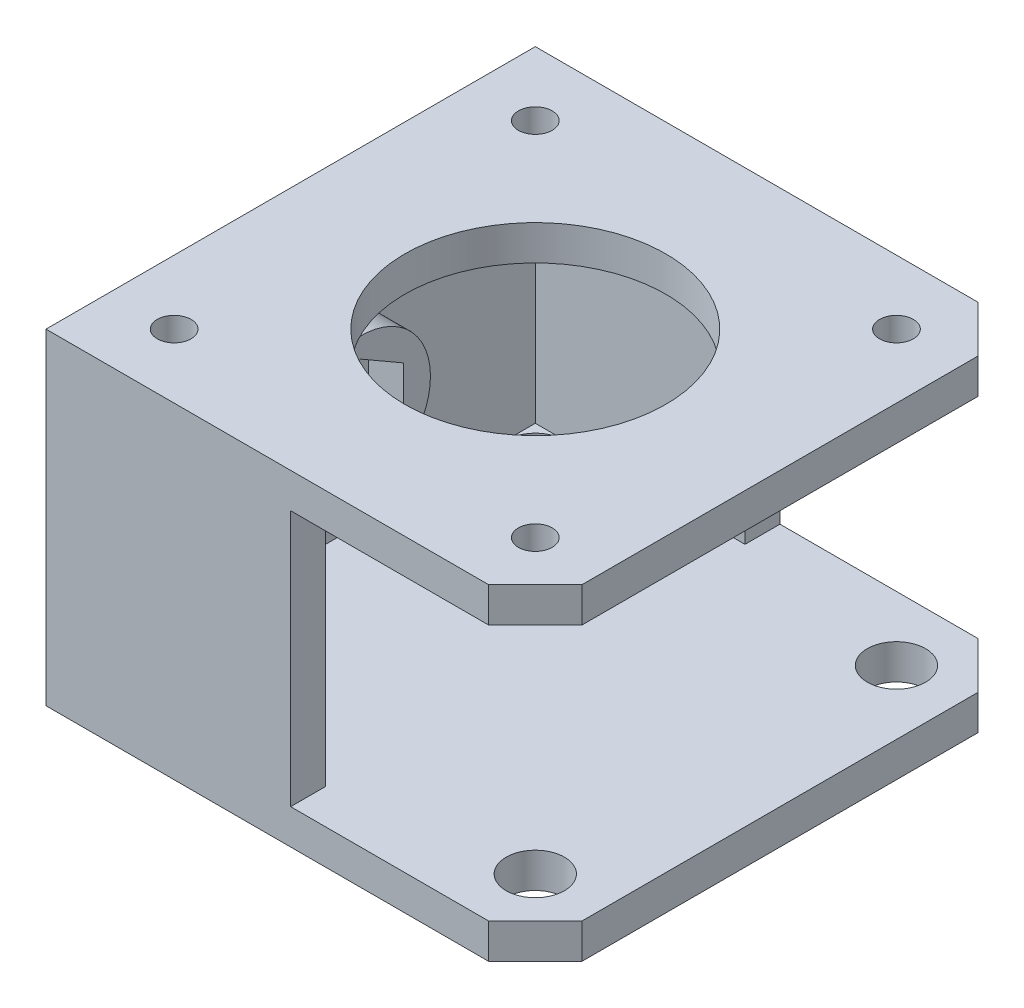
ISO-10303-21;
HEADER;
FILE_DESCRIPTION(('STEP AP214'),'2;1');
FILE_NAME('part.step','',(''),(''),'','','');
FILE_SCHEMA(('AUTOMOTIVE_DESIGN { 1 0 10303 214 1 1 1 1 }'));
ENDSEC;
DATA;
#1=APPLICATION_CONTEXT('core data for automotive mechanical design processes');
#2=APPLICATION_PROTOCOL_DEFINITION('international standard','automotive_design',2000,#1);
#3=PRODUCT_CONTEXT('',#1,'mechanical');
#4=PRODUCT('Part','Part','',(#3));
#5=PRODUCT_RELATED_PRODUCT_CATEGORY('part','',(#4));
#6=PRODUCT_DEFINITION_FORMATION('','',#4);
#7=PRODUCT_DEFINITION_CONTEXT('part definition',#1,'design');
#8=PRODUCT_DEFINITION('design','',#6,#7);
#9=PRODUCT_DEFINITION_SHAPE('','',#8);
#10=(LENGTH_UNIT() NAMED_UNIT(*) SI_UNIT(.MILLI.,.METRE.));
#11=(NAMED_UNIT(*) PLANE_ANGLE_UNIT() SI_UNIT($,.RADIAN.));
#12=(NAMED_UNIT(*) SI_UNIT($,.STERADIAN.) SOLID_ANGLE_UNIT());
#13=UNCERTAINTY_MEASURE_WITH_UNIT(LENGTH_MEASURE(1.E-05),#10,'distance_accuracy_value','');
#14=(GEOMETRIC_REPRESENTATION_CONTEXT(3) GLOBAL_UNCERTAINTY_ASSIGNED_CONTEXT((#13)) GLOBAL_UNIT_ASSIGNED_CONTEXT((#10,
#11,#12)) REPRESENTATION_CONTEXT('',''));
#15=CARTESIAN_POINT('',(0.,0.,0.));
#16=DIRECTION('',(0.,0.,1.));
#17=DIRECTION('',(1.,0.,0.));
#18=AXIS2_PLACEMENT_3D('',#15,#16,#17);
#19=CARTESIAN_POINT('',(0.,-22.,0.));
#20=DIRECTION('',(0.,-1.,0.));
#21=DIRECTION('',(0.,0.,-1.));
#22=AXIS2_PLACEMENT_3D('',#19,#20,#21);
#23=PLANE('',#22);
#24=CARTESIAN_POINT('',(15.5,-22.,-15.5));
#25=DIRECTION('',(0.,1.,0.));
#26=DIRECTION('',(0.,0.,1.));
#27=AXIS2_PLACEMENT_3D('',#24,#25,#26);
#28=CIRCLE('',#27,2.5);
#29=CARTESIAN_POINT('',(15.5,-22.,-13.));
#30=VERTEX_POINT('',#29);
#31=EDGE_CURVE('E314',#30,#30,#28,.T.);
#32=ORIENTED_EDGE('',*,*,#31,.F.);
#33=EDGE_LOOP('',(#32));
#34=FACE_BOUND('',#33,.T.);
#35=CARTESIAN_POINT('',(15.5,-22.,15.5));
#36=DIRECTION('',(0.,1.,0.));
#37=DIRECTION('',(0.,0.,1.));
#38=AXIS2_PLACEMENT_3D('',#35,#36,#37);
#39=CIRCLE('',#38,2.50000000000082);
#40=CARTESIAN_POINT('',(15.5,-22.,18.0000000000008));
#41=VERTEX_POINT('',#40);
#42=EDGE_CURVE('E317',#41,#41,#39,.T.);
#43=ORIENTED_EDGE('',*,*,#42,.F.);
#44=EDGE_LOOP('',(#43));
#45=FACE_BOUND('',#44,.T.);
#46=DIRECTION('',(0.,0.,-1.));
#47=VECTOR('',#46,1.);
#48=CARTESIAN_POINT('',(21.,-22.,0.));
#49=LINE('',#48,#47);
#50=CARTESIAN_POINT('',(21.,-22.,17.));
#51=VERTEX_POINT('',#50);
#52=CARTESIAN_POINT('',(21.,-22.,-17.));
#53=VERTEX_POINT('',#52);
#54=EDGE_CURVE('E240',#51,#53,#49,.T.);
#55=ORIENTED_EDGE('',*,*,#54,.T.);
#56=DIRECTION('',(-0.707106781186548,0.,-0.707106781186548));
#57=VECTOR('',#56,1.);
#58=CARTESIAN_POINT('',(17.,-22.,-21.));
#59=LINE('',#58,#57);
#60=CARTESIAN_POINT('',(17.,-22.,-21.));
#61=VERTEX_POINT('',#60);
#62=EDGE_CURVE('E465',#53,#61,#59,.T.);
#63=ORIENTED_EDGE('',*,*,#62,.T.);
#64=DIRECTION('',(1.,0.,0.));
#65=VECTOR('',#64,1.);
#66=CARTESIAN_POINT('',(0.,-22.,-21.));
#67=LINE('',#66,#65);
#68=CARTESIAN_POINT('',(0.,-22.,-21.));
#69=VERTEX_POINT('',#68);
#70=EDGE_CURVE('E243',#69,#61,#67,.T.);
#71=ORIENTED_EDGE('',*,*,#70,.F.);
#72=DIRECTION('',(0.,0.,1.));
#73=VECTOR('',#72,1.);
#74=CARTESIAN_POINT('',(0.,-22.,0.));
#75=LINE('',#74,#73);
#76=CARTESIAN_POINT('',(0.,-22.,-18.));
#77=VERTEX_POINT('',#76);
#78=EDGE_CURVE('E361',#69,#77,#75,.T.);
#79=ORIENTED_EDGE('',*,*,#78,.T.);
#80=DIRECTION('',(1.,0.,0.));
#81=VECTOR('',#80,1.);
#82=CARTESIAN_POINT('',(0.,-22.,-18.));
#83=LINE('',#82,#81);
#84=CARTESIAN_POINT('',(-15.5,-22.,-18.));
#85=VERTEX_POINT('',#84);
#86=EDGE_CURVE('E234',#85,#77,#83,.T.);
#87=ORIENTED_EDGE('',*,*,#86,.F.);
#88=CARTESIAN_POINT('',(-15.5,-22.,-15.5));
#89=DIRECTION('',(0.,-1.,0.));
#90=DIRECTION('',(0.,0.,-1.));
#91=AXIS2_PLACEMENT_3D('',#88,#89,#90);
#92=CIRCLE('',#91,2.49999999999975);
#93=CARTESIAN_POINT('',(-17.9999999999997,-22.,-15.5));
#94=VERTEX_POINT('',#93);
#95=EDGE_CURVE('E220',#85,#94,#92,.T.);
#96=ORIENTED_EDGE('',*,*,#95,.T.);
#97=DIRECTION('',(0.,0.,-1.));
#98=VECTOR('',#97,1.);
#99=CARTESIAN_POINT('',(-18.,-22.,0.));
#100=LINE('',#99,#98);
#101=CARTESIAN_POINT('',(-18.0000000000006,-22.,15.5));
#102=VERTEX_POINT('',#101);
#103=EDGE_CURVE('E224',#102,#94,#100,.T.);
#104=ORIENTED_EDGE('',*,*,#103,.F.);
#105=CARTESIAN_POINT('',(-15.5,-22.,15.5));
#106=DIRECTION('',(0.,1.,0.));
#107=DIRECTION('',(0.,0.,1.));
#108=AXIS2_PLACEMENT_3D('',#105,#106,#107);
#109=CIRCLE('',#108,2.50000000000057);
#110=CARTESIAN_POINT('',(-15.5,-22.,18.));
#111=VERTEX_POINT('',#110);
#112=EDGE_CURVE('E203',#111,#102,#109,.T.);
#113=ORIENTED_EDGE('',*,*,#112,.F.);
#114=DIRECTION('',(1.,0.,0.));
#115=VECTOR('',#114,1.);
#116=CARTESIAN_POINT('',(0.,-22.,18.));
#117=LINE('',#116,#115);
#118=CARTESIAN_POINT('',(0.,-22.,18.));
#119=VERTEX_POINT('',#118);
#120=EDGE_CURVE('E434',#111,#119,#117,.T.);
#121=ORIENTED_EDGE('',*,*,#120,.T.);
#122=DIRECTION('',(0.,0.,1.));
#123=VECTOR('',#122,1.);
#124=CARTESIAN_POINT('',(0.,-22.,0.));
#125=LINE('',#124,#123);
#126=CARTESIAN_POINT('',(0.,-22.,21.));
#127=VERTEX_POINT('',#126);
#128=EDGE_CURVE('E517',#119,#127,#125,.T.);
#129=ORIENTED_EDGE('',*,*,#128,.T.);
#130=DIRECTION('',(1.,0.,0.));
#131=VECTOR('',#130,1.);
#132=CARTESIAN_POINT('',(0.,-22.,21.));
#133=LINE('',#132,#131);
#134=CARTESIAN_POINT('',(17.,-22.,21.));
#135=VERTEX_POINT('',#134);
#136=EDGE_CURVE('E238',#127,#135,#133,.T.);
#137=ORIENTED_EDGE('',*,*,#136,.T.);
#138=DIRECTION('',(-0.707106781186548,0.,0.707106781186548));
#139=VECTOR('',#138,1.);
#140=CARTESIAN_POINT('',(21.,-22.,17.));
#141=LINE('',#140,#139);
#142=EDGE_CURVE('E463',#135,#51,#141,.F.);
#143=ORIENTED_EDGE('',*,*,#142,.T.);
#144=EDGE_LOOP('',(#55,#63,#71,#79,#87,#96,#104,#113,#121,#129,#137,#143));
#145=FACE_BOUND('',#144,.T.);
#146=ADVANCED_FACE('F40',(#34,#45,#145),#23,.F.);
#147=CARTESIAN_POINT('',(-18.,-22.,18.));
#148=VERTEX_POINT('',#147);
#149=EDGE_CURVE('E219',#148,#111,#117,.T.);
#150=ORIENTED_EDGE('',*,*,#149,.T.);
#151=CARTESIAN_POINT('',(-15.5,-22.,15.5));
#152=DIRECTION('',(0.,-1.,0.));
#153=DIRECTION('',(0.,0.,-1.));
#154=AXIS2_PLACEMENT_3D('',#151,#152,#153);
#155=CIRCLE('',#154,2.50000000000057);
#156=EDGE_CURVE('E206',#111,#102,#155,.T.);
#157=ORIENTED_EDGE('',*,*,#156,.T.);
#158=EDGE_CURVE('E217',#148,#102,#100,.T.);
#159=ORIENTED_EDGE('',*,*,#158,.F.);
#160=EDGE_LOOP('',(#150,#157,#159));
#161=FACE_BOUND('',#160,.T.);
#162=ADVANCED_FACE('F215',(#161),#23,.F.);
#163=CARTESIAN_POINT('',(-18.,-25.,0.));
#164=DIRECTION('',(1.,0.,0.));
#165=DIRECTION('',(0.,0.,-1.));
#166=AXIS2_PLACEMENT_3D('',#163,#164,#165);
#167=PLANE('',#166);
#168=CARTESIAN_POINT('',(-18.,-11.,0.));
#169=DIRECTION('',(1.,0.,0.));
#170=DIRECTION('',(0.,0.,-1.));
#171=AXIS2_PLACEMENT_3D('',#168,#169,#170);
#172=CIRCLE('',#171,2.2);
#173=CARTESIAN_POINT('',(-18.,-11.,-2.2));
#174=VERTEX_POINT('',#173);
#175=EDGE_CURVE('E252',#174,#174,#172,.T.);
#176=ORIENTED_EDGE('',*,*,#175,.F.);
#177=EDGE_LOOP('',(#176));
#178=FACE_BOUND('',#177,.T.);
#179=DIRECTION('',(0.,0.5,0.866025403784439));
#180=VECTOR('',#179,1.);
#181=CARTESIAN_POINT('',(-18.,-5.04570600599758,2.91313972081442));
#182=LINE('',#181,#180);
#183=CARTESIAN_POINT('',(-18.,-8.86380400399839,-3.7));
#184=VERTEX_POINT('',#183);
#185=CARTESIAN_POINT('',(-18.,-6.72760800799677,0.));
#186=VERTEX_POINT('',#185);
#187=EDGE_CURVE('E292',#184,#186,#182,.T.);
#188=ORIENTED_EDGE('',*,*,#187,.T.);
#189=DIRECTION('',(0.,-0.5,0.866025403784439));
#190=VECTOR('',#189,1.);
#191=CARTESIAN_POINT('',(-18.,-5.04570600599758,-2.91313972081441));
#192=LINE('',#191,#190);
#193=CARTESIAN_POINT('',(-18.,-8.86380400399839,3.7));
#194=VERTEX_POINT('',#193);
#195=EDGE_CURVE('E282',#186,#194,#192,.T.);
#196=ORIENTED_EDGE('',*,*,#195,.T.);
#197=DIRECTION('',(0.,-1.,0.));
#198=VECTOR('',#197,1.);
#199=CARTESIAN_POINT('',(-18.,0.,3.7));
#200=LINE('',#199,#198);
#201=CARTESIAN_POINT('',(-18.,-13.1361959960016,3.7));
#202=VERTEX_POINT('',#201);
#203=EDGE_CURVE('E284',#194,#202,#200,.T.);
#204=ORIENTED_EDGE('',*,*,#203,.T.);
#205=DIRECTION('',(0.,-0.5,-0.866025403784439));
#206=VECTOR('',#205,1.);
#207=CARTESIAN_POINT('',(-18.,-11.4542939940024,6.61313972081442));
#208=LINE('',#207,#206);
#209=CARTESIAN_POINT('',(-18.,-15.2723919920032,0.));
#210=VERTEX_POINT('',#209);
#211=EDGE_CURVE('E286',#202,#210,#208,.T.);
#212=ORIENTED_EDGE('',*,*,#211,.T.);
#213=DIRECTION('',(0.,0.5,-0.866025403784439));
#214=VECTOR('',#213,1.);
#215=CARTESIAN_POINT('',(-18.,-11.4542939940024,-6.61313972081441));
#216=LINE('',#215,#214);
#217=CARTESIAN_POINT('',(-18.,-13.1361959960016,-3.7));
#218=VERTEX_POINT('',#217);
#219=EDGE_CURVE('E288',#210,#218,#216,.T.);
#220=ORIENTED_EDGE('',*,*,#219,.T.);
#221=DIRECTION('',(0.,1.,0.));
#222=VECTOR('',#221,1.);
#223=CARTESIAN_POINT('',(-18.,0.,-3.7));
#224=LINE('',#223,#222);
#225=EDGE_CURVE('E290',#218,#184,#224,.T.);
#226=ORIENTED_EDGE('',*,*,#225,.T.);
#227=EDGE_LOOP('',(#188,#196,#204,#212,#220,#226));
#228=FACE_BOUND('',#227,.T.);
#229=ADVANCED_FACE('F341',(#178,#228),#167,.T.);
#230=CARTESIAN_POINT('',(0.,-25.,0.));
#231=DIRECTION('',(-1.,0.,0.));
#232=DIRECTION('',(0.,0.,1.));
#233=AXIS2_PLACEMENT_3D('',#230,#231,#232);
#234=PLANE('',#233);
#235=ORIENTED_EDGE('',*,*,#128,.F.);
#236=DIRECTION('',(0.,1.,0.));
#237=VECTOR('',#236,1.);
#238=CARTESIAN_POINT('',(0.,-25.,18.));
#239=LINE('',#238,#237);
#240=CARTESIAN_POINT('',(0.,0.,18.));
#241=VERTEX_POINT('',#240);
#242=EDGE_CURVE('E372',#119,#241,#239,.T.);
#243=ORIENTED_EDGE('',*,*,#242,.T.);
#244=DIRECTION('',(0.,0.,1.));
#245=VECTOR('',#244,1.);
#246=CARTESIAN_POINT('',(0.,0.,0.));
#247=LINE('',#246,#245);
#248=CARTESIAN_POINT('',(0.,0.,21.));
#249=VERTEX_POINT('',#248);
#250=EDGE_CURVE('E519',#241,#249,#247,.T.);
#251=ORIENTED_EDGE('',*,*,#250,.T.);
#252=DIRECTION('',(0.,1.,0.));
#253=VECTOR('',#252,1.);
#254=CARTESIAN_POINT('',(0.,-25.,21.));
#255=LINE('',#254,#253);
#256=EDGE_CURVE('E411',#127,#249,#255,.T.);
#257=ORIENTED_EDGE('',*,*,#256,.F.);
#258=EDGE_LOOP('',(#235,#243,#251,#257));
#259=FACE_BOUND('',#258,.T.);
#260=ADVANCED_FACE('F539',(#259),#234,.F.);
#261=CARTESIAN_POINT('',(0.,-25.,0.));
#262=DIRECTION('',(-1.,0.,0.));
#263=DIRECTION('',(0.,0.,1.));
#264=AXIS2_PLACEMENT_3D('',#261,#262,#263);
#265=PLANE('',#264);
#266=ORIENTED_EDGE('',*,*,#78,.F.);
#267=DIRECTION('',(0.,1.,0.));
#268=VECTOR('',#267,1.);
#269=CARTESIAN_POINT('',(0.,-25.,-21.));
#270=LINE('',#269,#268);
#271=CARTESIAN_POINT('',(0.,0.,-21.));
#272=VERTEX_POINT('',#271);
#273=EDGE_CURVE('E370',#69,#272,#270,.T.);
#274=ORIENTED_EDGE('',*,*,#273,.T.);
#275=DIRECTION('',(0.,0.,1.));
#276=VECTOR('',#275,1.);
#277=CARTESIAN_POINT('',(0.,0.,0.));
#278=LINE('',#277,#276);
#279=CARTESIAN_POINT('',(0.,0.,-18.));
#280=VERTEX_POINT('',#279);
#281=EDGE_CURVE('E523',#272,#280,#278,.T.);
#282=ORIENTED_EDGE('',*,*,#281,.T.);
#283=DIRECTION('',(0.,1.,0.));
#284=VECTOR('',#283,1.);
#285=CARTESIAN_POINT('',(0.,-25.,-18.));
#286=LINE('',#285,#284);
#287=EDGE_CURVE('E368',#77,#280,#286,.T.);
#288=ORIENTED_EDGE('',*,*,#287,.F.);
#289=EDGE_LOOP('',(#266,#274,#282,#288));
#290=FACE_BOUND('',#289,.T.);
#291=ADVANCED_FACE('F515',(#290),#265,.F.);
#292=CARTESIAN_POINT('',(0.,-25.,-18.));
#293=DIRECTION('',(0.,0.,1.));
#294=DIRECTION('',(1.,0.,0.));
#295=AXIS2_PLACEMENT_3D('',#292,#293,#294);
#296=PLANE('',#295);
#297=DIRECTION('',(0.,1.,0.));
#298=VECTOR('',#297,1.);
#299=CARTESIAN_POINT('',(-18.,-25.,-18.));
#300=LINE('',#299,#298);
#301=CARTESIAN_POINT('',(-18.,-22.,-18.));
#302=VERTEX_POINT('',#301);
#303=CARTESIAN_POINT('',(-18.,0.,-18.));
#304=VERTEX_POINT('',#303);
#305=EDGE_CURVE('E363',#302,#304,#300,.T.);
#306=ORIENTED_EDGE('',*,*,#305,.F.);
#307=EDGE_CURVE('E235',#302,#85,#83,.T.);
#308=ORIENTED_EDGE('',*,*,#307,.T.);
#309=ORIENTED_EDGE('',*,*,#86,.T.);
#310=ORIENTED_EDGE('',*,*,#287,.T.);
#311=DIRECTION('',(1.,0.,0.));
#312=VECTOR('',#311,1.);
#313=CARTESIAN_POINT('',(0.,0.,-18.));
#314=LINE('',#313,#312);
#315=EDGE_CURVE('E366',#304,#280,#314,.T.);
#316=ORIENTED_EDGE('',*,*,#315,.F.);
#317=EDGE_LOOP('',(#306,#308,#309,#310,#316));
#318=FACE_BOUND('',#317,.T.);
#319=ADVANCED_FACE('F364',(#318),#296,.T.);
#320=CARTESIAN_POINT('',(-18.,-11.,0.));
#321=DIRECTION('',(1.,0.,0.));
#322=DIRECTION('',(0.,0.,-1.));
#323=AXIS2_PLACEMENT_3D('',#320,#321,#322);
#324=CIRCLE('',#323,6.);
#325=CARTESIAN_POINT('',(-18.,-11.,-6.));
#326=VERTEX_POINT('',#325);
#327=EDGE_CURVE('E278',#326,#326,#324,.T.);
#328=ORIENTED_EDGE('',*,*,#327,.F.);
#329=EDGE_LOOP('',(#328));
#330=FACE_BOUND('',#329,.T.);
#331=DIRECTION('',(0.,1.,0.));
#332=VECTOR('',#331,1.);
#333=CARTESIAN_POINT('',(-18.,-25.,18.));
#334=LINE('',#333,#332);
#335=CARTESIAN_POINT('',(-18.,0.,18.));
#336=VERTEX_POINT('',#335);
#337=EDGE_CURVE('E233',#148,#336,#334,.T.);
#338=ORIENTED_EDGE('',*,*,#337,.F.);
#339=ORIENTED_EDGE('',*,*,#158,.T.);
#340=ORIENTED_EDGE('',*,*,#103,.T.);
#341=EDGE_CURVE('E228',#94,#302,#100,.T.);
#342=ORIENTED_EDGE('',*,*,#341,.T.);
#343=ORIENTED_EDGE('',*,*,#305,.T.);
#344=DIRECTION('',(0.,0.,-1.));
#345=VECTOR('',#344,1.);
#346=CARTESIAN_POINT('',(-18.,0.,0.));
#347=LINE('',#346,#345);
#348=EDGE_CURVE('E530',#336,#304,#347,.T.);
#349=ORIENTED_EDGE('',*,*,#348,.F.);
#350=EDGE_LOOP('',(#338,#339,#340,#342,#343,#349));
#351=FACE_BOUND('',#350,.T.);
#352=ADVANCED_FACE('F231',(#330,#351),#167,.T.);
#353=CARTESIAN_POINT('',(0.,-25.,18.));
#354=DIRECTION('',(0.,0.,1.));
#355=DIRECTION('',(1.,0.,0.));
#356=AXIS2_PLACEMENT_3D('',#353,#354,#355);
#357=PLANE('',#356);
#358=ORIENTED_EDGE('',*,*,#149,.F.);
#359=ORIENTED_EDGE('',*,*,#337,.T.);
#360=DIRECTION('',(1.,0.,0.));
#361=VECTOR('',#360,1.);
#362=CARTESIAN_POINT('',(0.,0.,18.));
#363=LINE('',#362,#361);
#364=EDGE_CURVE('E527',#336,#241,#363,.T.);
#365=ORIENTED_EDGE('',*,*,#364,.T.);
#366=ORIENTED_EDGE('',*,*,#242,.F.);
#367=ORIENTED_EDGE('',*,*,#120,.F.);
#368=EDGE_LOOP('',(#358,#359,#365,#366,#367));
#369=FACE_BOUND('',#368,.T.);
#370=ADVANCED_FACE('F542',(#369),#357,.F.);
#371=CARTESIAN_POINT('',(0.,0.,0.));
#372=DIRECTION('',(0.,1.,0.));
#373=DIRECTION('',(0.,0.,1.));
#374=AXIS2_PLACEMENT_3D('',#371,#372,#373);
#375=PLANE('',#374);
#376=CARTESIAN_POINT('',(0.,0.,0.));
#377=DIRECTION('',(0.,1.,0.));
#378=DIRECTION('',(0.,0.,1.));
#379=AXIS2_PLACEMENT_3D('',#376,#377,#378);
#380=CIRCLE('',#379,11.2);
#381=CARTESIAN_POINT('',(0.,0.,11.2));
#382=VERTEX_POINT('',#381);
#383=EDGE_CURVE('E382',#382,#382,#380,.T.);
#384=ORIENTED_EDGE('',*,*,#383,.T.);
#385=EDGE_LOOP('',(#384));
#386=FACE_BOUND('',#385,.T.);
#387=CARTESIAN_POINT('',(-15.5,0.,-15.5));
#388=DIRECTION('',(0.,1.,0.));
#389=DIRECTION('',(0.,0.,1.));
#390=AXIS2_PLACEMENT_3D('',#387,#388,#389);
#391=CIRCLE('',#390,1.45);
#392=CARTESIAN_POINT('',(-15.5,0.,-14.05));
#393=VERTEX_POINT('',#392);
#394=EDGE_CURVE('E426',#393,#393,#391,.T.);
#395=ORIENTED_EDGE('',*,*,#394,.T.);
#396=EDGE_LOOP('',(#395));
#397=FACE_BOUND('',#396,.T.);
#398=CARTESIAN_POINT('',(15.5,0.,-15.5));
#399=DIRECTION('',(0.,1.,0.));
#400=DIRECTION('',(0.,0.,1.));
#401=AXIS2_PLACEMENT_3D('',#398,#399,#400);
#402=CIRCLE('',#401,1.45);
#403=CARTESIAN_POINT('',(15.5,0.,-14.05));
#404=VERTEX_POINT('',#403);
#405=EDGE_CURVE('E423',#404,#404,#402,.T.);
#406=ORIENTED_EDGE('',*,*,#405,.T.);
#407=EDGE_LOOP('',(#406));
#408=FACE_BOUND('',#407,.T.);
#409=CARTESIAN_POINT('',(15.5,0.,15.5));
#410=DIRECTION('',(0.,1.,0.));
#411=DIRECTION('',(0.,0.,1.));
#412=AXIS2_PLACEMENT_3D('',#409,#410,#411);
#413=CIRCLE('',#412,1.45);
#414=CARTESIAN_POINT('',(15.5,0.,16.95));
#415=VERTEX_POINT('',#414);
#416=EDGE_CURVE('E420',#415,#415,#413,.T.);
#417=ORIENTED_EDGE('',*,*,#416,.T.);
#418=EDGE_LOOP('',(#417));
#419=FACE_BOUND('',#418,.T.);
#420=CARTESIAN_POINT('',(-15.5,0.,15.5));
#421=DIRECTION('',(0.,1.,0.));
#422=DIRECTION('',(0.,0.,1.));
#423=AXIS2_PLACEMENT_3D('',#420,#421,#422);
#424=CIRCLE('',#423,1.45);
#425=CARTESIAN_POINT('',(-15.5,0.,16.95));
#426=VERTEX_POINT('',#425);
#427=EDGE_CURVE('E417',#426,#426,#424,.T.);
#428=ORIENTED_EDGE('',*,*,#427,.T.);
#429=EDGE_LOOP('',(#428));
#430=FACE_BOUND('',#429,.T.);
#431=DIRECTION('',(1.,0.,0.));
#432=VECTOR('',#431,1.);
#433=CARTESIAN_POINT('',(0.,0.,-21.));
#434=LINE('',#433,#432);
#435=CARTESIAN_POINT('',(17.,0.,-21.));
#436=VERTEX_POINT('',#435);
#437=EDGE_CURVE('E414',#272,#436,#434,.T.);
#438=ORIENTED_EDGE('',*,*,#437,.T.);
#439=DIRECTION('',(0.707106781186548,0.,0.707106781186548));
#440=VECTOR('',#439,1.);
#441=CARTESIAN_POINT('',(17.,0.,-21.));
#442=LINE('',#441,#440);
#443=CARTESIAN_POINT('',(21.,0.,-17.));
#444=VERTEX_POINT('',#443);
#445=EDGE_CURVE('E445',#436,#444,#442,.T.);
#446=ORIENTED_EDGE('',*,*,#445,.T.);
#447=DIRECTION('',(0.,0.,-1.));
#448=VECTOR('',#447,1.);
#449=CARTESIAN_POINT('',(21.,0.,0.));
#450=LINE('',#449,#448);
#451=CARTESIAN_POINT('',(21.,0.,17.));
#452=VERTEX_POINT('',#451);
#453=EDGE_CURVE('E410',#452,#444,#450,.T.);
#454=ORIENTED_EDGE('',*,*,#453,.F.);
#455=DIRECTION('',(0.707106781186548,0.,-0.707106781186548));
#456=VECTOR('',#455,1.);
#457=CARTESIAN_POINT('',(21.,0.,17.));
#458=LINE('',#457,#456);
#459=CARTESIAN_POINT('',(17.,0.,21.));
#460=VERTEX_POINT('',#459);
#461=EDGE_CURVE('E443',#452,#460,#458,.F.);
#462=ORIENTED_EDGE('',*,*,#461,.T.);
#463=DIRECTION('',(1.,0.,0.));
#464=VECTOR('',#463,1.);
#465=CARTESIAN_POINT('',(0.,0.,21.));
#466=LINE('',#465,#464);
#467=EDGE_CURVE('E407',#249,#460,#466,.T.);
#468=ORIENTED_EDGE('',*,*,#467,.F.);
#469=ORIENTED_EDGE('',*,*,#250,.F.);
#470=ORIENTED_EDGE('',*,*,#364,.F.);
#471=ORIENTED_EDGE('',*,*,#348,.T.);
#472=ORIENTED_EDGE('',*,*,#315,.T.);
#473=ORIENTED_EDGE('',*,*,#281,.F.);
#474=EDGE_LOOP('',(#438,#446,#454,#462,#468,#469,#470,#471,#472,#473));
#475=FACE_BOUND('',#474,.T.);
#476=ADVANCED_FACE('F483',(#386,#397,#408,#419,#430,#475),#375,.F.);
#477=CARTESIAN_POINT('',(-21.,3.,0.));
#478=DIRECTION('',(-1.,0.,0.));
#479=DIRECTION('',(0.,0.,1.));
#480=AXIS2_PLACEMENT_3D('',#477,#478,#479);
#481=PLANE('',#480);
#482=CARTESIAN_POINT('',(-21.,-11.,0.));
#483=DIRECTION('',(1.,0.,0.));
#484=DIRECTION('',(0.,0.,-1.));
#485=AXIS2_PLACEMENT_3D('',#482,#483,#484);
#486=CIRCLE('',#485,2.2);
#487=CARTESIAN_POINT('',(-21.,-11.,-2.2));
#488=VERTEX_POINT('',#487);
#489=EDGE_CURVE('E247',#488,#488,#486,.T.);
#490=ORIENTED_EDGE('',*,*,#489,.T.);
#491=EDGE_LOOP('',(#490));
#492=FACE_BOUND('',#491,.T.);
#493=DIRECTION('',(0.,0.,-1.));
#494=VECTOR('',#493,1.);
#495=CARTESIAN_POINT('',(-21.,-25.,0.));
#496=LINE('',#495,#494);
#497=CARTESIAN_POINT('',(-21.,-25.,21.));
#498=VERTEX_POINT('',#497);
#499=CARTESIAN_POINT('',(-21.,-25.,-21.));
#500=VERTEX_POINT('',#499);
#501=EDGE_CURVE('E500',#498,#500,#496,.T.);
#502=ORIENTED_EDGE('',*,*,#501,.F.);
#503=DIRECTION('',(0.,-1.,0.));
#504=VECTOR('',#503,1.);
#505=CARTESIAN_POINT('',(-21.,3.,21.));
#506=LINE('',#505,#504);
#507=CARTESIAN_POINT('',(-21.,3.,21.));
#508=VERTEX_POINT('',#507);
#509=EDGE_CURVE('E432',#508,#498,#506,.T.);
#510=ORIENTED_EDGE('',*,*,#509,.F.);
#511=DIRECTION('',(0.,0.,-1.));
#512=VECTOR('',#511,1.);
#513=CARTESIAN_POINT('',(-21.,3.,0.));
#514=LINE('',#513,#512);
#515=CARTESIAN_POINT('',(-21.,3.,-21.));
#516=VERTEX_POINT('',#515);
#517=EDGE_CURVE('E378',#508,#516,#514,.T.);
#518=ORIENTED_EDGE('',*,*,#517,.T.);
#519=DIRECTION('',(0.,-1.,0.));
#520=VECTOR('',#519,1.);
#521=CARTESIAN_POINT('',(-21.,3.,-21.));
#522=LINE('',#521,#520);
#523=EDGE_CURVE('E406',#516,#500,#522,.T.);
#524=ORIENTED_EDGE('',*,*,#523,.T.);
#525=EDGE_LOOP('',(#502,#510,#518,#524));
#526=FACE_BOUND('',#525,.T.);
#527=ADVANCED_FACE('F499',(#492,#526),#481,.T.);
#528=CARTESIAN_POINT('',(0.,3.,21.));
#529=DIRECTION('',(0.,0.,-1.));
#530=DIRECTION('',(-1.,0.,0.));
#531=AXIS2_PLACEMENT_3D('',#528,#529,#530);
#532=PLANE('',#531);
#533=DIRECTION('',(1.,0.,0.));
#534=VECTOR('',#533,1.);
#535=CARTESIAN_POINT('',(0.,-25.,21.));
#536=LINE('',#535,#534);
#537=CARTESIAN_POINT('',(17.,-25.,21.));
#538=VERTEX_POINT('',#537);
#539=EDGE_CURVE('E377',#498,#538,#536,.T.);
#540=ORIENTED_EDGE('',*,*,#539,.T.);
#541=DIRECTION('',(0.,1.,0.));
#542=VECTOR('',#541,1.);
#543=CARTESIAN_POINT('',(17.,3.,21.));
#544=LINE('',#543,#542);
#545=EDGE_CURVE('E11',#538,#135,#544,.T.);
#546=ORIENTED_EDGE('',*,*,#545,.T.);
#547=ORIENTED_EDGE('',*,*,#136,.F.);
#548=ORIENTED_EDGE('',*,*,#256,.T.);
#549=ORIENTED_EDGE('',*,*,#467,.T.);
#550=DIRECTION('',(0.,1.,0.));
#551=VECTOR('',#550,1.);
#552=CARTESIAN_POINT('',(17.,3.,21.));
#553=LINE('',#552,#551);
#554=CARTESIAN_POINT('',(17.,3.,21.));
#555=VERTEX_POINT('',#554);
#556=EDGE_CURVE('E49',#460,#555,#553,.T.);
#557=ORIENTED_EDGE('',*,*,#556,.T.);
#558=DIRECTION('',(1.,0.,0.));
#559=VECTOR('',#558,1.);
#560=CARTESIAN_POINT('',(0.,3.,21.));
#561=LINE('',#560,#559);
#562=EDGE_CURVE('E381',#508,#555,#561,.T.);
#563=ORIENTED_EDGE('',*,*,#562,.F.);
#564=ORIENTED_EDGE('',*,*,#509,.T.);
#565=EDGE_LOOP('',(#540,#546,#547,#548,#549,#557,#563,#564));
#566=FACE_BOUND('',#565,.T.);
#567=ADVANCED_FACE('F468',(#566),#532,.F.);
#568=CARTESIAN_POINT('',(21.,3.,0.));
#569=DIRECTION('',(-1.,0.,0.));
#570=DIRECTION('',(0.,0.,1.));
#571=AXIS2_PLACEMENT_3D('',#568,#569,#570);
#572=PLANE('',#571);
#573=ORIENTED_EDGE('',*,*,#453,.T.);
#574=DIRECTION('',(0.,1.,0.));
#575=VECTOR('',#574,1.);
#576=CARTESIAN_POINT('',(21.,3.,-17.));
#577=LINE('',#576,#575);
#578=CARTESIAN_POINT('',(21.,3.,-17.));
#579=VERTEX_POINT('',#578);
#580=EDGE_CURVE('E450',#444,#579,#577,.T.);
#581=ORIENTED_EDGE('',*,*,#580,.T.);
#582=DIRECTION('',(0.,0.,-1.));
#583=VECTOR('',#582,1.);
#584=CARTESIAN_POINT('',(21.,3.,0.));
#585=LINE('',#584,#583);
#586=CARTESIAN_POINT('',(21.,3.,17.));
#587=VERTEX_POINT('',#586);
#588=EDGE_CURVE('E385',#587,#579,#585,.T.);
#589=ORIENTED_EDGE('',*,*,#588,.F.);
#590=DIRECTION('',(0.,-1.,0.));
#591=VECTOR('',#590,1.);
#592=CARTESIAN_POINT('',(21.,3.,17.));
#593=LINE('',#592,#591);
#594=EDGE_CURVE('E447',#587,#452,#593,.T.);
#595=ORIENTED_EDGE('',*,*,#594,.T.);
#596=EDGE_LOOP('',(#573,#581,#589,#595));
#597=FACE_BOUND('',#596,.T.);
#598=ADVANCED_FACE('F480',(#597),#572,.F.);
#599=CARTESIAN_POINT('',(-15.5,3.,-15.5));
#600=DIRECTION('',(0.,-1.,0.));
#601=DIRECTION('',(0.,0.,-1.));
#602=AXIS2_PLACEMENT_3D('',#599,#600,#601);
#603=CYLINDRICAL_SURFACE('',#602,1.45);
#604=CARTESIAN_POINT('',(-15.5,3.,-15.5));
#605=DIRECTION('',(0.,1.,0.));
#606=DIRECTION('',(0.,0.,1.));
#607=AXIS2_PLACEMENT_3D('',#604,#605,#606);
#608=CIRCLE('',#607,1.45);
#609=CARTESIAN_POINT('',(-15.5,3.,-14.05));
#610=VERTEX_POINT('',#609);
#611=EDGE_CURVE('E400',#610,#610,#608,.T.);
#612=ORIENTED_EDGE('',*,*,#611,.T.);
#613=EDGE_LOOP('',(#612));
#614=FACE_BOUND('',#613,.T.);
#615=ORIENTED_EDGE('',*,*,#394,.F.);
#616=EDGE_LOOP('',(#615));
#617=FACE_BOUND('',#616,.T.);
#618=ADVANCED_FACE('F563',(#614,#617),#603,.F.);
#619=CARTESIAN_POINT('',(15.5,3.,-15.5));
#620=DIRECTION('',(0.,-1.,0.));
#621=DIRECTION('',(0.,0.,-1.));
#622=AXIS2_PLACEMENT_3D('',#619,#620,#621);
#623=CYLINDRICAL_SURFACE('',#622,1.45);
#624=CARTESIAN_POINT('',(15.5,3.,-15.5));
#625=DIRECTION('',(0.,1.,0.));
#626=DIRECTION('',(0.,0.,1.));
#627=AXIS2_PLACEMENT_3D('',#624,#625,#626);
#628=CIRCLE('',#627,1.45);
#629=CARTESIAN_POINT('',(15.5,3.,-14.05));
#630=VERTEX_POINT('',#629);
#631=EDGE_CURVE('E397',#630,#630,#628,.T.);
#632=ORIENTED_EDGE('',*,*,#631,.T.);
#633=EDGE_LOOP('',(#632));
#634=FACE_BOUND('',#633,.T.);
#635=ORIENTED_EDGE('',*,*,#405,.F.);
#636=EDGE_LOOP('',(#635));
#637=FACE_BOUND('',#636,.T.);
#638=ADVANCED_FACE('F566',(#634,#637),#623,.F.);
#639=CARTESIAN_POINT('',(15.5,3.,15.5));
#640=DIRECTION('',(0.,-1.,0.));
#641=DIRECTION('',(0.,0.,-1.));
#642=AXIS2_PLACEMENT_3D('',#639,#640,#641);
#643=CYLINDRICAL_SURFACE('',#642,1.45);
#644=CARTESIAN_POINT('',(15.5,3.,15.5));
#645=DIRECTION('',(0.,1.,0.));
#646=DIRECTION('',(0.,0.,1.));
#647=AXIS2_PLACEMENT_3D('',#644,#645,#646);
#648=CIRCLE('',#647,1.45);
#649=CARTESIAN_POINT('',(15.5,3.,16.95));
#650=VERTEX_POINT('',#649);
#651=EDGE_CURVE('E394',#650,#650,#648,.T.);
#652=ORIENTED_EDGE('',*,*,#651,.T.);
#653=EDGE_LOOP('',(#652));
#654=FACE_BOUND('',#653,.T.);
#655=ORIENTED_EDGE('',*,*,#416,.F.);
#656=EDGE_LOOP('',(#655));
#657=FACE_BOUND('',#656,.T.);
#658=ADVANCED_FACE('F570',(#654,#657),#643,.F.);
#659=CARTESIAN_POINT('',(-15.5,3.,15.5));
#660=DIRECTION('',(0.,-1.,0.));
#661=DIRECTION('',(0.,0.,-1.));
#662=AXIS2_PLACEMENT_3D('',#659,#660,#661);
#663=CYLINDRICAL_SURFACE('',#662,1.45);
#664=CARTESIAN_POINT('',(-15.5,3.,15.5));
#665=DIRECTION('',(0.,1.,0.));
#666=DIRECTION('',(0.,0.,1.));
#667=AXIS2_PLACEMENT_3D('',#664,#665,#666);
#668=CIRCLE('',#667,1.45);
#669=CARTESIAN_POINT('',(-15.5,3.,16.95));
#670=VERTEX_POINT('',#669);
#671=EDGE_CURVE('E391',#670,#670,#668,.T.);
#672=ORIENTED_EDGE('',*,*,#671,.T.);
#673=EDGE_LOOP('',(#672));
#674=FACE_BOUND('',#673,.T.);
#675=ORIENTED_EDGE('',*,*,#427,.F.);
#676=EDGE_LOOP('',(#675));
#677=FACE_BOUND('',#676,.T.);
#678=ADVANCED_FACE('F574',(#674,#677),#663,.F.);
#679=CARTESIAN_POINT('',(0.,3.,-21.));
#680=DIRECTION('',(0.,0.,-1.));
#681=DIRECTION('',(-1.,0.,0.));
#682=AXIS2_PLACEMENT_3D('',#679,#680,#681);
#683=PLANE('',#682);
#684=DIRECTION('',(1.,0.,0.));
#685=VECTOR('',#684,1.);
#686=CARTESIAN_POINT('',(0.,3.,-21.));
#687=LINE('',#686,#685);
#688=CARTESIAN_POINT('',(17.,3.,-21.));
#689=VERTEX_POINT('',#688);
#690=EDGE_CURVE('E388',#516,#689,#687,.T.);
#691=ORIENTED_EDGE('',*,*,#690,.T.);
#692=DIRECTION('',(0.,-1.,0.));
#693=VECTOR('',#692,1.);
#694=CARTESIAN_POINT('',(17.,0.,-21.));
#695=LINE('',#694,#693);
#696=EDGE_CURVE('E440',#689,#436,#695,.T.);
#697=ORIENTED_EDGE('',*,*,#696,.T.);
#698=ORIENTED_EDGE('',*,*,#437,.F.);
#699=ORIENTED_EDGE('',*,*,#273,.F.);
#700=ORIENTED_EDGE('',*,*,#70,.T.);
#701=DIRECTION('',(0.,-1.,0.));
#702=VECTOR('',#701,1.);
#703=CARTESIAN_POINT('',(17.,-25.,-21.));
#704=LINE('',#703,#702);
#705=CARTESIAN_POINT('',(17.,-25.,-21.));
#706=VERTEX_POINT('',#705);
#707=EDGE_CURVE('E437',#61,#706,#704,.T.);
#708=ORIENTED_EDGE('',*,*,#707,.T.);
#709=DIRECTION('',(1.,0.,0.));
#710=VECTOR('',#709,1.);
#711=CARTESIAN_POINT('',(0.,-25.,-21.));
#712=LINE('',#711,#710);
#713=EDGE_CURVE('E495',#500,#706,#712,.T.);
#714=ORIENTED_EDGE('',*,*,#713,.F.);
#715=ORIENTED_EDGE('',*,*,#523,.F.);
#716=EDGE_LOOP('',(#691,#697,#698,#699,#700,#708,#714,#715));
#717=FACE_BOUND('',#716,.T.);
#718=ADVANCED_FACE('F491',(#717),#683,.T.);
#719=CARTESIAN_POINT('',(0.,3.,0.));
#720=DIRECTION('',(0.,-1.,0.));
#721=DIRECTION('',(0.,0.,-1.));
#722=AXIS2_PLACEMENT_3D('',#719,#720,#721);
#723=CYLINDRICAL_SURFACE('',#722,11.2);
#724=CARTESIAN_POINT('',(0.,3.,0.));
#725=DIRECTION('',(0.,1.,0.));
#726=DIRECTION('',(0.,0.,1.));
#727=AXIS2_PLACEMENT_3D('',#724,#725,#726);
#728=CIRCLE('',#727,11.2);
#729=CARTESIAN_POINT('',(0.,3.,11.2));
#730=VERTEX_POINT('',#729);
#731=EDGE_CURVE('E403',#730,#730,#728,.T.);
#732=ORIENTED_EDGE('',*,*,#731,.T.);
#733=EDGE_LOOP('',(#732));
#734=FACE_BOUND('',#733,.T.);
#735=ORIENTED_EDGE('',*,*,#383,.F.);
#736=EDGE_LOOP('',(#735));
#737=FACE_BOUND('',#736,.T.);
#738=ADVANCED_FACE('F558',(#734,#737),#723,.F.);
#739=CARTESIAN_POINT('',(0.,3.,0.));
#740=DIRECTION('',(0.,1.,0.));
#741=DIRECTION('',(0.,0.,1.));
#742=AXIS2_PLACEMENT_3D('',#739,#740,#741);
#743=PLANE('',#742);
#744=ORIENTED_EDGE('',*,*,#588,.T.);
#745=DIRECTION('',(-0.707106781186548,0.,-0.707106781186548));
#746=VECTOR('',#745,1.);
#747=CARTESIAN_POINT('',(19.,3.,-19.));
#748=LINE('',#747,#746);
#749=EDGE_CURVE('E454',#579,#689,#748,.T.);
#750=ORIENTED_EDGE('',*,*,#749,.T.);
#751=ORIENTED_EDGE('',*,*,#690,.F.);
#752=ORIENTED_EDGE('',*,*,#517,.F.);
#753=ORIENTED_EDGE('',*,*,#562,.T.);
#754=DIRECTION('',(-0.707106781186548,0.,0.707106781186548));
#755=VECTOR('',#754,1.);
#756=CARTESIAN_POINT('',(19.,3.,19.));
#757=LINE('',#756,#755);
#758=EDGE_CURVE('E452',#555,#587,#757,.F.);
#759=ORIENTED_EDGE('',*,*,#758,.T.);
#760=EDGE_LOOP('',(#744,#750,#751,#752,#753,#759));
#761=FACE_BOUND('',#760,.T.);
#762=ORIENTED_EDGE('',*,*,#671,.F.);
#763=EDGE_LOOP('',(#762));
#764=FACE_BOUND('',#763,.T.);
#765=ORIENTED_EDGE('',*,*,#651,.F.);
#766=EDGE_LOOP('',(#765));
#767=FACE_BOUND('',#766,.T.);
#768=ORIENTED_EDGE('',*,*,#631,.F.);
#769=EDGE_LOOP('',(#768));
#770=FACE_BOUND('',#769,.T.);
#771=ORIENTED_EDGE('',*,*,#611,.F.);
#772=EDGE_LOOP('',(#771));
#773=FACE_BOUND('',#772,.T.);
#774=ORIENTED_EDGE('',*,*,#731,.F.);
#775=EDGE_LOOP('',(#774));
#776=FACE_BOUND('',#775,.T.);
#777=ADVANCED_FACE('F354',(#761,#764,#767,#770,#773,#776),#743,.T.);
#778=CARTESIAN_POINT('',(0.,-25.,0.));
#779=DIRECTION('',(0.,1.,0.));
#780=DIRECTION('',(0.,0.,1.));
#781=AXIS2_PLACEMENT_3D('',#778,#779,#780);
#782=PLANE('',#781);
#783=CARTESIAN_POINT('',(-15.5,-25.,-15.5));
#784=DIRECTION('',(0.,1.,0.));
#785=DIRECTION('',(0.,0.,1.));
#786=AXIS2_PLACEMENT_3D('',#783,#784,#785);
#787=CIRCLE('',#786,2.49999999999975);
#788=CARTESIAN_POINT('',(-15.5,-25.,-13.0000000000002));
#789=VERTEX_POINT('',#788);
#790=EDGE_CURVE('E320',#789,#789,#787,.T.);
#791=ORIENTED_EDGE('',*,*,#790,.T.);
#792=EDGE_LOOP('',(#791));
#793=FACE_BOUND('',#792,.T.);
#794=CARTESIAN_POINT('',(-15.5,-25.,15.5));
#795=DIRECTION('',(0.,1.,0.));
#796=DIRECTION('',(0.,0.,1.));
#797=AXIS2_PLACEMENT_3D('',#794,#795,#796);
#798=CIRCLE('',#797,2.50000000000057);
#799=CARTESIAN_POINT('',(-15.5,-25.,18.0000000000006));
#800=VERTEX_POINT('',#799);
#801=EDGE_CURVE('E211',#800,#800,#798,.T.);
#802=ORIENTED_EDGE('',*,*,#801,.T.);
#803=EDGE_LOOP('',(#802));
#804=FACE_BOUND('',#803,.T.);
#805=CARTESIAN_POINT('',(15.5,-25.,15.5));
#806=DIRECTION('',(0.,1.,0.));
#807=DIRECTION('',(0.,0.,1.));
#808=AXIS2_PLACEMENT_3D('',#805,#806,#807);
#809=CIRCLE('',#808,2.50000000000082);
#810=CARTESIAN_POINT('',(15.5,-25.,18.0000000000008));
#811=VERTEX_POINT('',#810);
#812=EDGE_CURVE('E210',#811,#811,#809,.T.);
#813=ORIENTED_EDGE('',*,*,#812,.T.);
#814=EDGE_LOOP('',(#813));
#815=FACE_BOUND('',#814,.T.);
#816=CARTESIAN_POINT('',(15.5,-25.,-15.5));
#817=DIRECTION('',(0.,1.,0.));
#818=DIRECTION('',(0.,0.,1.));
#819=AXIS2_PLACEMENT_3D('',#816,#817,#818);
#820=CIRCLE('',#819,2.5);
#821=CARTESIAN_POINT('',(15.5,-25.,-13.));
#822=VERTEX_POINT('',#821);
#823=EDGE_CURVE('E294',#822,#822,#820,.T.);
#824=ORIENTED_EDGE('',*,*,#823,.T.);
#825=EDGE_LOOP('',(#824));
#826=FACE_BOUND('',#825,.T.);
#827=ORIENTED_EDGE('',*,*,#713,.T.);
#828=DIRECTION('',(0.707106781186548,0.,0.707106781186548));
#829=VECTOR('',#828,1.);
#830=CARTESIAN_POINT('',(17.,-25.,-21.));
#831=LINE('',#830,#829);
#832=CARTESIAN_POINT('',(21.,-25.,-17.));
#833=VERTEX_POINT('',#832);
#834=EDGE_CURVE('E458',#706,#833,#831,.T.);
#835=ORIENTED_EDGE('',*,*,#834,.T.);
#836=DIRECTION('',(0.,0.,-1.));
#837=VECTOR('',#836,1.);
#838=CARTESIAN_POINT('',(21.,-25.,0.));
#839=LINE('',#838,#837);
#840=CARTESIAN_POINT('',(21.,-25.,17.));
#841=VERTEX_POINT('',#840);
#842=EDGE_CURVE('E246',#841,#833,#839,.T.);
#843=ORIENTED_EDGE('',*,*,#842,.F.);
#844=DIRECTION('',(0.707106781186548,0.,-0.707106781186548));
#845=VECTOR('',#844,1.);
#846=CARTESIAN_POINT('',(21.,-25.,17.));
#847=LINE('',#846,#845);
#848=EDGE_CURVE('E456',#841,#538,#847,.F.);
#849=ORIENTED_EDGE('',*,*,#848,.T.);
#850=ORIENTED_EDGE('',*,*,#539,.F.);
#851=ORIENTED_EDGE('',*,*,#501,.T.);
#852=EDGE_LOOP('',(#827,#835,#843,#849,#850,#851));
#853=FACE_BOUND('',#852,.T.);
#854=ADVANCED_FACE('F347',(#793,#804,#815,#826,#853),#782,.F.);
#855=ORIENTED_EDGE('',*,*,#341,.F.);
#856=CARTESIAN_POINT('',(-15.5,-22.,-15.5));
#857=DIRECTION('',(0.,1.,0.));
#858=DIRECTION('',(0.,0.,1.));
#859=AXIS2_PLACEMENT_3D('',#856,#857,#858);
#860=CIRCLE('',#859,2.49999999999975);
#861=EDGE_CURVE('E323',#85,#94,#860,.T.);
#862=ORIENTED_EDGE('',*,*,#861,.F.);
#863=ORIENTED_EDGE('',*,*,#307,.F.);
#864=EDGE_LOOP('',(#855,#862,#863));
#865=FACE_BOUND('',#864,.T.);
#866=ADVANCED_FACE('F337',(#865),#23,.F.);
#867=CARTESIAN_POINT('',(21.,-22.,0.));
#868=DIRECTION('',(-1.,0.,0.));
#869=DIRECTION('',(0.,0.,1.));
#870=AXIS2_PLACEMENT_3D('',#867,#868,#869);
#871=PLANE('',#870);
#872=ORIENTED_EDGE('',*,*,#842,.T.);
#873=DIRECTION('',(0.,1.,0.));
#874=VECTOR('',#873,1.);
#875=CARTESIAN_POINT('',(21.,-22.,-17.));
#876=LINE('',#875,#874);
#877=EDGE_CURVE('E62',#833,#53,#876,.T.);
#878=ORIENTED_EDGE('',*,*,#877,.T.);
#879=ORIENTED_EDGE('',*,*,#54,.F.);
#880=DIRECTION('',(0.,-1.,0.));
#881=VECTOR('',#880,1.);
#882=CARTESIAN_POINT('',(21.,-22.,17.));
#883=LINE('',#882,#881);
#884=EDGE_CURVE('E460',#51,#841,#883,.T.);
#885=ORIENTED_EDGE('',*,*,#884,.T.);
#886=EDGE_LOOP('',(#872,#878,#879,#885));
#887=FACE_BOUND('',#886,.T.);
#888=ADVANCED_FACE('F346',(#887),#871,.F.);
#889=CARTESIAN_POINT('',(-21.,-11.,0.));
#890=DIRECTION('',(1.,0.,0.));
#891=DIRECTION('',(0.,0.,-1.));
#892=AXIS2_PLACEMENT_3D('',#889,#890,#891);
#893=CYLINDRICAL_SURFACE('',#892,2.2);
#894=ORIENTED_EDGE('',*,*,#489,.F.);
#895=EDGE_LOOP('',(#894));
#896=FACE_BOUND('',#895,.T.);
#897=ORIENTED_EDGE('',*,*,#175,.T.);
#898=EDGE_LOOP('',(#897));
#899=FACE_BOUND('',#898,.T.);
#900=ADVANCED_FACE('F353',(#896,#899),#893,.F.);
#901=CARTESIAN_POINT('',(-15.,-5.04570600599758,2.91313972081442));
#902=DIRECTION('',(0.,-0.866025403784438,0.5));
#903=DIRECTION('',(0.,-0.5,-0.866025403784439));
#904=AXIS2_PLACEMENT_3D('',#901,#902,#903);
#905=PLANE('',#904);
#906=ORIENTED_EDGE('',*,*,#187,.F.);
#907=DIRECTION('',(-1.,0.,0.));
#908=VECTOR('',#907,1.);
#909=CARTESIAN_POINT('',(-15.,-8.86380400399839,-3.7));
#910=LINE('',#909,#908);
#911=CARTESIAN_POINT('',(-15.,-8.86380400399839,-3.7));
#912=VERTEX_POINT('',#911);
#913=EDGE_CURVE('E257',#912,#184,#910,.T.);
#914=ORIENTED_EDGE('',*,*,#913,.F.);
#915=DIRECTION('',(0.,0.5,0.866025403784439));
#916=VECTOR('',#915,1.);
#917=CARTESIAN_POINT('',(-15.,-5.04570600599758,2.91313972081442));
#918=LINE('',#917,#916);
#919=CARTESIAN_POINT('',(-15.,-6.72760800799677,0.));
#920=VERTEX_POINT('',#919);
#921=EDGE_CURVE('E281',#912,#920,#918,.T.);
#922=ORIENTED_EDGE('',*,*,#921,.T.);
#923=DIRECTION('',(-1.,0.,0.));
#924=VECTOR('',#923,1.);
#925=CARTESIAN_POINT('',(-15.,-6.72760800799677,0.));
#926=LINE('',#925,#924);
#927=EDGE_CURVE('E274',#920,#186,#926,.T.);
#928=ORIENTED_EDGE('',*,*,#927,.T.);
#929=EDGE_LOOP('',(#906,#914,#922,#928));
#930=FACE_BOUND('',#929,.T.);
#931=ADVANCED_FACE('F835',(#930),#905,.T.);
#932=CARTESIAN_POINT('',(-15.,0.,-3.7));
#933=DIRECTION('',(0.,0.,1.));
#934=DIRECTION('',(0.,-1.,0.));
#935=AXIS2_PLACEMENT_3D('',#932,#933,#934);
#936=PLANE('',#935);
#937=ORIENTED_EDGE('',*,*,#225,.F.);
#938=DIRECTION('',(-1.,0.,0.));
#939=VECTOR('',#938,1.);
#940=CARTESIAN_POINT('',(-15.,-13.1361959960016,-3.7));
#941=LINE('',#940,#939);
#942=CARTESIAN_POINT('',(-15.,-13.1361959960016,-3.7));
#943=VERTEX_POINT('',#942);
#944=EDGE_CURVE('E262',#943,#218,#941,.T.);
#945=ORIENTED_EDGE('',*,*,#944,.F.);
#946=DIRECTION('',(0.,1.,0.));
#947=VECTOR('',#946,1.);
#948=CARTESIAN_POINT('',(-15.,0.,-3.7));
#949=LINE('',#948,#947);
#950=EDGE_CURVE('E309',#943,#912,#949,.T.);
#951=ORIENTED_EDGE('',*,*,#950,.T.);
#952=ORIENTED_EDGE('',*,*,#913,.T.);
#953=EDGE_LOOP('',(#937,#945,#951,#952));
#954=FACE_BOUND('',#953,.T.);
#955=ADVANCED_FACE('F824',(#954),#936,.T.);
#956=CARTESIAN_POINT('',(-15.,-11.4542939940024,-6.61313972081441));
#957=DIRECTION('',(0.,0.866025403784439,0.5));
#958=DIRECTION('',(0.,-0.5,0.866025403784439));
#959=AXIS2_PLACEMENT_3D('',#956,#957,#958);
#960=PLANE('',#959);
#961=ORIENTED_EDGE('',*,*,#219,.F.);
#962=DIRECTION('',(-1.,0.,0.));
#963=VECTOR('',#962,1.);
#964=CARTESIAN_POINT('',(-15.,-15.2723919920032,0.));
#965=LINE('',#964,#963);
#966=CARTESIAN_POINT('',(-15.,-15.2723919920032,0.));
#967=VERTEX_POINT('',#966);
#968=EDGE_CURVE('E265',#967,#210,#965,.T.);
#969=ORIENTED_EDGE('',*,*,#968,.F.);
#970=DIRECTION('',(0.,0.5,-0.866025403784439));
#971=VECTOR('',#970,1.);
#972=CARTESIAN_POINT('',(-15.,-11.4542939940024,-6.61313972081441));
#973=LINE('',#972,#971);
#974=EDGE_CURVE('E306',#967,#943,#973,.T.);
#975=ORIENTED_EDGE('',*,*,#974,.T.);
#976=ORIENTED_EDGE('',*,*,#944,.T.);
#977=EDGE_LOOP('',(#961,#969,#975,#976));
#978=FACE_BOUND('',#977,.T.);
#979=ADVANCED_FACE('F813',(#978),#960,.T.);
#980=CARTESIAN_POINT('',(-15.,-11.4542939940024,6.61313972081442));
#981=DIRECTION('',(0.,0.866025403784439,-0.5));
#982=DIRECTION('',(0.,0.5,0.866025403784439));
#983=AXIS2_PLACEMENT_3D('',#980,#981,#982);
#984=PLANE('',#983);
#985=ORIENTED_EDGE('',*,*,#211,.F.);
#986=DIRECTION('',(-1.,0.,0.));
#987=VECTOR('',#986,1.);
#988=CARTESIAN_POINT('',(-15.,-13.1361959960016,3.7));
#989=LINE('',#988,#987);
#990=CARTESIAN_POINT('',(-15.,-13.1361959960016,3.7));
#991=VERTEX_POINT('',#990);
#992=EDGE_CURVE('E268',#991,#202,#989,.T.);
#993=ORIENTED_EDGE('',*,*,#992,.F.);
#994=DIRECTION('',(0.,-0.5,-0.866025403784439));
#995=VECTOR('',#994,1.);
#996=CARTESIAN_POINT('',(-15.,-11.4542939940024,6.61313972081442));
#997=LINE('',#996,#995);
#998=EDGE_CURVE('E303',#991,#967,#997,.T.);
#999=ORIENTED_EDGE('',*,*,#998,.T.);
#1000=ORIENTED_EDGE('',*,*,#968,.T.);
#1001=EDGE_LOOP('',(#985,#993,#999,#1000));
#1002=FACE_BOUND('',#1001,.T.);
#1003=ADVANCED_FACE('F802',(#1002),#984,.T.);
#1004=CARTESIAN_POINT('',(-15.,0.,3.7));
#1005=DIRECTION('',(0.,0.,-1.));
#1006=DIRECTION('',(0.,1.,0.));
#1007=AXIS2_PLACEMENT_3D('',#1004,#1005,#1006);
#1008=PLANE('',#1007);
#1009=ORIENTED_EDGE('',*,*,#203,.F.);
#1010=DIRECTION('',(-1.,0.,0.));
#1011=VECTOR('',#1010,1.);
#1012=CARTESIAN_POINT('',(-15.,-8.86380400399839,3.7));
#1013=LINE('',#1012,#1011);
#1014=CARTESIAN_POINT('',(-15.,-8.86380400399839,3.7));
#1015=VERTEX_POINT('',#1014);
#1016=EDGE_CURVE('E271',#1015,#194,#1013,.T.);
#1017=ORIENTED_EDGE('',*,*,#1016,.F.);
#1018=DIRECTION('',(0.,-1.,0.));
#1019=VECTOR('',#1018,1.);
#1020=CARTESIAN_POINT('',(-15.,0.,3.7));
#1021=LINE('',#1020,#1019);
#1022=EDGE_CURVE('E300',#1015,#991,#1021,.T.);
#1023=ORIENTED_EDGE('',*,*,#1022,.T.);
#1024=ORIENTED_EDGE('',*,*,#992,.T.);
#1025=EDGE_LOOP('',(#1009,#1017,#1023,#1024));
#1026=FACE_BOUND('',#1025,.T.);
#1027=ADVANCED_FACE('F791',(#1026),#1008,.T.);
#1028=CARTESIAN_POINT('',(-15.,-5.04570600599758,-2.91313972081441));
#1029=DIRECTION('',(0.,-0.866025403784439,-0.5));
#1030=DIRECTION('',(0.,0.5,-0.866025403784439));
#1031=AXIS2_PLACEMENT_3D('',#1028,#1029,#1030);
#1032=PLANE('',#1031);
#1033=ORIENTED_EDGE('',*,*,#195,.F.);
#1034=ORIENTED_EDGE('',*,*,#927,.F.);
#1035=DIRECTION('',(0.,-0.5,0.866025403784439));
#1036=VECTOR('',#1035,1.);
#1037=CARTESIAN_POINT('',(-15.,-5.04570600599758,-2.91313972081441));
#1038=LINE('',#1037,#1036);
#1039=EDGE_CURVE('E297',#920,#1015,#1038,.T.);
#1040=ORIENTED_EDGE('',*,*,#1039,.T.);
#1041=ORIENTED_EDGE('',*,*,#1016,.T.);
#1042=EDGE_LOOP('',(#1033,#1034,#1040,#1041));
#1043=FACE_BOUND('',#1042,.T.);
#1044=ADVANCED_FACE('F780',(#1043),#1032,.T.);
#1045=CARTESIAN_POINT('',(-15.,-11.,0.));
#1046=DIRECTION('',(-1.,0.,0.));
#1047=DIRECTION('',(0.,0.,1.));
#1048=AXIS2_PLACEMENT_3D('',#1045,#1046,#1047);
#1049=CYLINDRICAL_SURFACE('',#1048,6.);
#1050=CARTESIAN_POINT('',(-15.,-11.,0.));
#1051=DIRECTION('',(1.,0.,0.));
#1052=DIRECTION('',(0.,0.,-1.));
#1053=AXIS2_PLACEMENT_3D('',#1050,#1051,#1052);
#1054=CIRCLE('',#1053,6.);
#1055=CARTESIAN_POINT('',(-15.,-11.,-6.));
#1056=VERTEX_POINT('',#1055);
#1057=EDGE_CURVE('E277',#1056,#1056,#1054,.T.);
#1058=ORIENTED_EDGE('',*,*,#1057,.F.);
#1059=EDGE_LOOP('',(#1058));
#1060=FACE_BOUND('',#1059,.T.);
#1061=ORIENTED_EDGE('',*,*,#327,.T.);
#1062=EDGE_LOOP('',(#1061));
#1063=FACE_BOUND('',#1062,.T.);
#1064=ADVANCED_FACE('F769',(#1060,#1063),#1049,.T.);
#1065=CARTESIAN_POINT('',(-15.,0.,0.));
#1066=DIRECTION('',(1.,0.,0.));
#1067=DIRECTION('',(0.,0.,-1.));
#1068=AXIS2_PLACEMENT_3D('',#1065,#1066,#1067);
#1069=PLANE('',#1068);
#1070=ORIENTED_EDGE('',*,*,#921,.F.);
#1071=ORIENTED_EDGE('',*,*,#950,.F.);
#1072=ORIENTED_EDGE('',*,*,#974,.F.);
#1073=ORIENTED_EDGE('',*,*,#998,.F.);
#1074=ORIENTED_EDGE('',*,*,#1022,.F.);
#1075=ORIENTED_EDGE('',*,*,#1039,.F.);
#1076=EDGE_LOOP('',(#1070,#1071,#1072,#1073,#1074,#1075));
#1077=FACE_BOUND('',#1076,.T.);
#1078=ORIENTED_EDGE('',*,*,#1057,.T.);
#1079=EDGE_LOOP('',(#1078));
#1080=FACE_BOUND('',#1079,.T.);
#1081=ADVANCED_FACE('F729',(#1077,#1080),#1069,.T.);
#1082=CARTESIAN_POINT('',(15.5,-25.,-15.5));
#1083=DIRECTION('',(0.,1.,0.));
#1084=DIRECTION('',(0.,0.,1.));
#1085=AXIS2_PLACEMENT_3D('',#1082,#1083,#1084);
#1086=CYLINDRICAL_SURFACE('',#1085,2.5);
#1087=ORIENTED_EDGE('',*,*,#823,.F.);
#1088=EDGE_LOOP('',(#1087));
#1089=FACE_BOUND('',#1088,.T.);
#1090=ORIENTED_EDGE('',*,*,#31,.T.);
#1091=EDGE_LOOP('',(#1090));
#1092=FACE_BOUND('',#1091,.T.);
#1093=ADVANCED_FACE('F719',(#1089,#1092),#1086,.F.);
#1094=CARTESIAN_POINT('',(15.5,-25.,15.5));
#1095=DIRECTION('',(0.,1.,0.));
#1096=DIRECTION('',(0.,0.,1.));
#1097=AXIS2_PLACEMENT_3D('',#1094,#1095,#1096);
#1098=CYLINDRICAL_SURFACE('',#1097,2.50000000000082);
#1099=ORIENTED_EDGE('',*,*,#812,.F.);
#1100=EDGE_LOOP('',(#1099));
#1101=FACE_BOUND('',#1100,.T.);
#1102=ORIENTED_EDGE('',*,*,#42,.T.);
#1103=EDGE_LOOP('',(#1102));
#1104=FACE_BOUND('',#1103,.T.);
#1105=ADVANCED_FACE('F332',(#1101,#1104),#1098,.F.);
#1106=CARTESIAN_POINT('',(-15.5,-25.,15.5));
#1107=DIRECTION('',(0.,1.,0.));
#1108=DIRECTION('',(0.,0.,1.));
#1109=AXIS2_PLACEMENT_3D('',#1106,#1107,#1108);
#1110=CYLINDRICAL_SURFACE('',#1109,2.50000000000057);
#1111=ORIENTED_EDGE('',*,*,#801,.F.);
#1112=EDGE_LOOP('',(#1111));
#1113=FACE_BOUND('',#1112,.T.);
#1114=ORIENTED_EDGE('',*,*,#112,.T.);
#1115=ORIENTED_EDGE('',*,*,#156,.F.);
#1116=EDGE_LOOP('',(#1114,#1115));
#1117=FACE_BOUND('',#1116,.T.);
#1118=ADVANCED_FACE('F205',(#1113,#1117),#1110,.F.);
#1119=CARTESIAN_POINT('',(-15.5,-25.,-15.5));
#1120=DIRECTION('',(0.,1.,0.));
#1121=DIRECTION('',(0.,0.,1.));
#1122=AXIS2_PLACEMENT_3D('',#1119,#1120,#1121);
#1123=CYLINDRICAL_SURFACE('',#1122,2.49999999999975);
#1124=ORIENTED_EDGE('',*,*,#790,.F.);
#1125=EDGE_LOOP('',(#1124));
#1126=FACE_BOUND('',#1125,.T.);
#1127=ORIENTED_EDGE('',*,*,#861,.T.);
#1128=ORIENTED_EDGE('',*,*,#95,.F.);
#1129=EDGE_LOOP('',(#1127,#1128));
#1130=FACE_BOUND('',#1129,.T.);
#1131=ADVANCED_FACE('F593',(#1126,#1130),#1123,.F.);
#1132=CARTESIAN_POINT('',(17.,3.,-21.));
#1133=DIRECTION('',(0.707106781186548,0.,-0.707106781186548));
#1134=DIRECTION('',(0.,1.,0.));
#1135=AXIS2_PLACEMENT_3D('',#1132,#1133,#1134);
#1136=PLANE('',#1135);
#1137=ORIENTED_EDGE('',*,*,#749,.F.);
#1138=ORIENTED_EDGE('',*,*,#580,.F.);
#1139=ORIENTED_EDGE('',*,*,#445,.F.);
#1140=ORIENTED_EDGE('',*,*,#696,.F.);
#1141=EDGE_LOOP('',(#1137,#1138,#1139,#1140));
#1142=FACE_BOUND('',#1141,.T.);
#1143=ADVANCED_FACE('F489',(#1142),#1136,.T.);
#1144=CARTESIAN_POINT('',(17.,3.,-21.));
#1145=DIRECTION('',(0.707106781186548,0.,-0.707106781186548));
#1146=DIRECTION('',(0.,1.,0.));
#1147=AXIS2_PLACEMENT_3D('',#1144,#1145,#1146);
#1148=PLANE('',#1147);
#1149=ORIENTED_EDGE('',*,*,#62,.F.);
#1150=ORIENTED_EDGE('',*,*,#877,.F.);
#1151=ORIENTED_EDGE('',*,*,#834,.F.);
#1152=ORIENTED_EDGE('',*,*,#707,.F.);
#1153=EDGE_LOOP('',(#1149,#1150,#1151,#1152));
#1154=FACE_BOUND('',#1153,.T.);
#1155=ADVANCED_FACE('F510',(#1154),#1148,.T.);
#1156=CARTESIAN_POINT('',(21.,-22.,17.));
#1157=DIRECTION('',(-0.707106781186548,0.,-0.707106781186548));
#1158=DIRECTION('',(0.,-1.,0.));
#1159=AXIS2_PLACEMENT_3D('',#1156,#1157,#1158);
#1160=PLANE('',#1159);
#1161=ORIENTED_EDGE('',*,*,#142,.F.);
#1162=ORIENTED_EDGE('',*,*,#545,.F.);
#1163=ORIENTED_EDGE('',*,*,#848,.F.);
#1164=ORIENTED_EDGE('',*,*,#884,.F.);
#1165=EDGE_LOOP('',(#1161,#1162,#1163,#1164));
#1166=FACE_BOUND('',#1165,.T.);
#1167=ADVANCED_FACE('F505',(#1166),#1160,.F.);
#1168=CARTESIAN_POINT('',(21.,3.,17.));
#1169=DIRECTION('',(-0.707106781186548,0.,-0.707106781186548));
#1170=DIRECTION('',(0.,-1.,0.));
#1171=AXIS2_PLACEMENT_3D('',#1168,#1169,#1170);
#1172=PLANE('',#1171);
#1173=ORIENTED_EDGE('',*,*,#758,.F.);
#1174=ORIENTED_EDGE('',*,*,#556,.F.);
#1175=ORIENTED_EDGE('',*,*,#461,.F.);
#1176=ORIENTED_EDGE('',*,*,#594,.F.);
#1177=EDGE_LOOP('',(#1173,#1174,#1175,#1176));
#1178=FACE_BOUND('',#1177,.T.);
#1179=ADVANCED_FACE('F43',(#1178),#1172,.F.);
#1180=CLOSED_SHELL('',(#146,#162,#229,#260,#291,#319,#352,#370,#476,#527,#567,#598,#618,#638,
#658,#678,#718,#738,#777,#854,#866,#888,#900,#931,#955,#979,#1003,#1027,#1044,#1064,#1081,#1093,
#1105,#1118,#1131,#1143,#1155,#1167,#1179));
#1181=MANIFOLD_SOLID_BREP('B2',#1180);
#1182=ADVANCED_BREP_SHAPE_REPRESENTATION('',(#18,#1181),#14);
#1183=SHAPE_DEFINITION_REPRESENTATION(#9,#1182);
ENDSEC;
END-ISO-10303-21;
